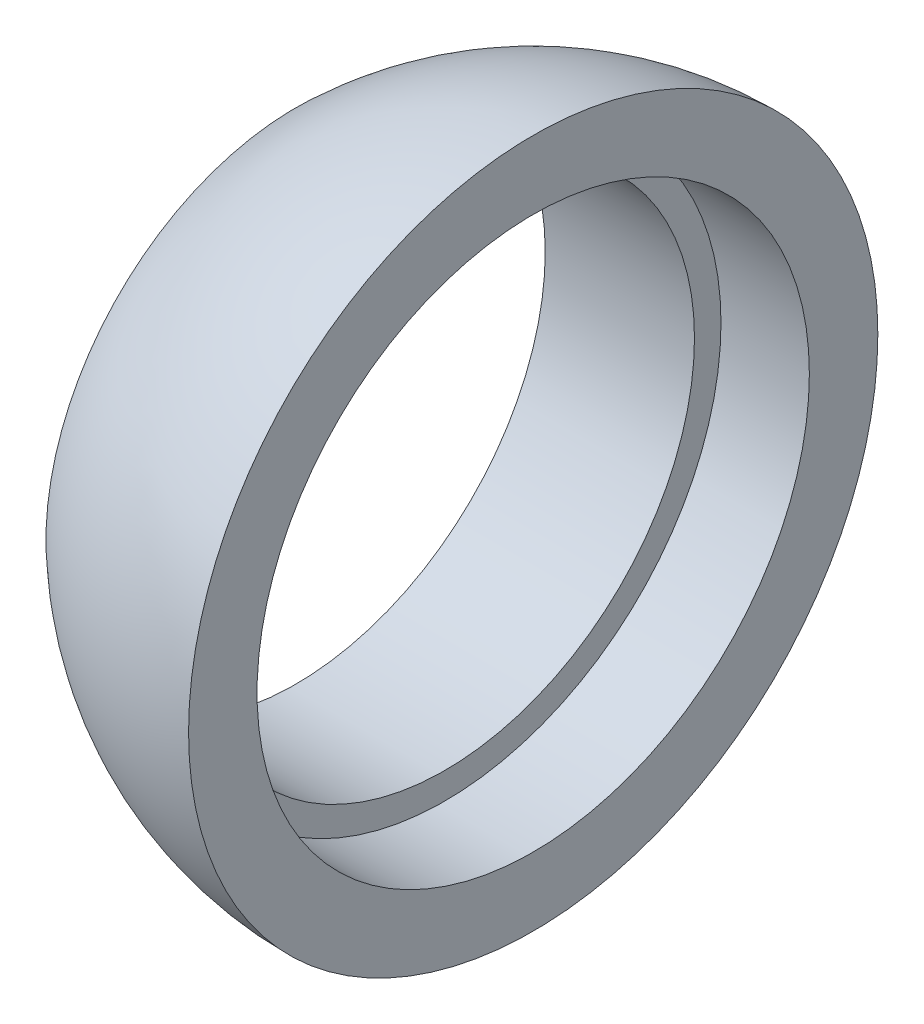
ISO-10303-21;
HEADER;
FILE_DESCRIPTION(('STEP AP214'),'2;1');
FILE_NAME('part.step','',(''),(''),'','','');
FILE_SCHEMA(('AUTOMOTIVE_DESIGN { 1 0 10303 214 1 1 1 1 }'));
ENDSEC;
DATA;
#1=APPLICATION_CONTEXT('core data for automotive mechanical design processes');
#2=APPLICATION_PROTOCOL_DEFINITION('international standard','automotive_design',2000,#1);
#3=PRODUCT_CONTEXT('',#1,'mechanical');
#4=PRODUCT('Part','Part','',(#3));
#5=PRODUCT_RELATED_PRODUCT_CATEGORY('part','',(#4));
#6=PRODUCT_DEFINITION_FORMATION('','',#4);
#7=PRODUCT_DEFINITION_CONTEXT('part definition',#1,'design');
#8=PRODUCT_DEFINITION('design','',#6,#7);
#9=PRODUCT_DEFINITION_SHAPE('','',#8);
#10=(LENGTH_UNIT() NAMED_UNIT(*) SI_UNIT(.MILLI.,.METRE.));
#11=(NAMED_UNIT(*) PLANE_ANGLE_UNIT() SI_UNIT($,.RADIAN.));
#12=(NAMED_UNIT(*) SI_UNIT($,.STERADIAN.) SOLID_ANGLE_UNIT());
#13=UNCERTAINTY_MEASURE_WITH_UNIT(LENGTH_MEASURE(1.E-05),#10,'distance_accuracy_value','');
#14=(GEOMETRIC_REPRESENTATION_CONTEXT(3) GLOBAL_UNCERTAINTY_ASSIGNED_CONTEXT((#13)) GLOBAL_UNIT_ASSIGNED_CONTEXT((#10,
#11,#12)) REPRESENTATION_CONTEXT('',''));
#15=CARTESIAN_POINT('',(0.,0.,0.));
#16=DIRECTION('',(0.,0.,1.));
#17=DIRECTION('',(1.,0.,0.));
#18=AXIS2_PLACEMENT_3D('',#15,#16,#17);
#19=CARTESIAN_POINT('',(-5.5,0.,0.));
#20=DIRECTION('',(1.,0.,0.));
#21=DIRECTION('',(0.,0.,-1.));
#22=AXIS2_PLACEMENT_3D('',#19,#20,#21);
#23=CYLINDRICAL_SURFACE('',#22,5.65);
#24=CARTESIAN_POINT('',(-5.37749941887491,0.,0.));
#25=DIRECTION('',(1.,0.,0.));
#26=DIRECTION('',(0.,0.,-1.));
#27=AXIS2_PLACEMENT_3D('',#24,#25,#26);
#28=CIRCLE('',#27,5.65);
#29=CARTESIAN_POINT('',(-5.37749941887491,0.,-5.65));
#30=VERTEX_POINT('',#29);
#31=EDGE_CURVE('E49',#30,#30,#28,.F.);
#32=ORIENTED_EDGE('',*,*,#31,.T.);
#33=EDGE_LOOP('',(#32));
#34=FACE_BOUND('',#33,.T.);
#35=CARTESIAN_POINT('',(-2.,0.,0.));
#36=DIRECTION('',(1.,0.,0.));
#37=DIRECTION('',(0.,0.,-1.));
#38=AXIS2_PLACEMENT_3D('',#35,#36,#37);
#39=CIRCLE('',#38,5.65);
#40=CARTESIAN_POINT('',(-2.,0.,-5.65));
#41=VERTEX_POINT('',#40);
#42=EDGE_CURVE('E45',#41,#41,#39,.F.);
#43=ORIENTED_EDGE('',*,*,#42,.F.);
#44=EDGE_LOOP('',(#43));
#45=FACE_BOUND('',#44,.T.);
#46=ADVANCED_FACE('F41',(#34,#45),#23,.F.);
#47=CARTESIAN_POINT('',(0.,0.,0.));
#48=DIRECTION('',(0.,1.,0.));
#49=DIRECTION('',(0.,0.,1.));
#50=AXIS2_PLACEMENT_3D('',#47,#48,#49);
#51=SPHERICAL_SURFACE('',#50,7.8);
#52=CARTESIAN_POINT('',(0.,0.,0.));
#53=DIRECTION('',(1.,0.,0.));
#54=DIRECTION('',(0.,0.,-1.));
#55=AXIS2_PLACEMENT_3D('',#52,#53,#54);
#56=SPHERICAL_SURFACE('',#55,7.8);
#57=ORIENTED_EDGE('',*,*,#31,.F.);
#58=EDGE_LOOP('',(#57));
#59=FACE_BOUND('',#58,.T.);
#60=CARTESIAN_POINT('',(0.,0.,0.));
#61=DIRECTION('',(-1.,0.,0.));
#62=DIRECTION('',(0.,0.,1.));
#63=AXIS2_PLACEMENT_3D('',#60,#61,#62);
#64=CIRCLE('',#63,7.8);
#65=CARTESIAN_POINT('',(0.,0.,7.8));
#66=VERTEX_POINT('',#65);
#67=EDGE_CURVE('E10',#66,#66,#64,.T.);
#68=ORIENTED_EDGE('',*,*,#67,.T.);
#69=EDGE_LOOP('',(#68));
#70=FACE_BOUND('',#69,.T.);
#71=ADVANCED_FACE('F43',(#59,#70),#56,.T.);
#72=CARTESIAN_POINT('',(0.,0.,0.));
#73=DIRECTION('',(-1.,0.,0.));
#74=DIRECTION('',(0.,0.,1.));
#75=AXIS2_PLACEMENT_3D('',#72,#73,#74);
#76=PLANE('',#75);
#77=CARTESIAN_POINT('',(0.,0.,0.));
#78=DIRECTION('',(1.,0.,0.));
#79=DIRECTION('',(0.,0.,-1.));
#80=AXIS2_PLACEMENT_3D('',#77,#78,#79);
#81=CIRCLE('',#80,6.25);
#82=CARTESIAN_POINT('',(0.,0.,-6.25));
#83=VERTEX_POINT('',#82);
#84=EDGE_CURVE('E55',#83,#83,#81,.T.);
#85=ORIENTED_EDGE('',*,*,#84,.F.);
#86=EDGE_LOOP('',(#85));
#87=FACE_BOUND('',#86,.T.);
#88=ORIENTED_EDGE('',*,*,#67,.F.);
#89=EDGE_LOOP('',(#88));
#90=FACE_BOUND('',#89,.T.);
#91=ADVANCED_FACE('F74',(#87,#90),#76,.F.);
#92=CARTESIAN_POINT('',(-2.,0.,0.));
#93=DIRECTION('',(1.,0.,0.));
#94=DIRECTION('',(0.,0.,-1.));
#95=AXIS2_PLACEMENT_3D('',#92,#93,#94);
#96=PLANE('',#95);
#97=CARTESIAN_POINT('',(-2.,0.,0.));
#98=DIRECTION('',(1.,0.,0.));
#99=DIRECTION('',(0.,0.,-1.));
#100=AXIS2_PLACEMENT_3D('',#97,#98,#99);
#101=CIRCLE('',#100,6.25);
#102=CARTESIAN_POINT('',(-2.,0.,-6.25));
#103=VERTEX_POINT('',#102);
#104=EDGE_CURVE('E58',#103,#103,#101,.T.);
#105=ORIENTED_EDGE('',*,*,#104,.T.);
#106=EDGE_LOOP('',(#105));
#107=FACE_BOUND('',#106,.T.);
#108=ORIENTED_EDGE('',*,*,#42,.T.);
#109=EDGE_LOOP('',(#108));
#110=FACE_BOUND('',#109,.T.);
#111=ADVANCED_FACE('F65',(#107,#110),#96,.T.);
#112=CARTESIAN_POINT('',(-2.,0.,0.));
#113=DIRECTION('',(1.,0.,0.));
#114=DIRECTION('',(0.,0.,-1.));
#115=AXIS2_PLACEMENT_3D('',#112,#113,#114);
#116=CYLINDRICAL_SURFACE('',#115,6.25);
#117=ORIENTED_EDGE('',*,*,#104,.F.);
#118=EDGE_LOOP('',(#117));
#119=FACE_BOUND('',#118,.T.);
#120=ORIENTED_EDGE('',*,*,#84,.T.);
#121=EDGE_LOOP('',(#120));
#122=FACE_BOUND('',#121,.T.);
#123=ADVANCED_FACE('F77',(#119,#122),#116,.F.);
#124=CLOSED_SHELL('',(#46,#71,#91,#111,#123));
#125=MANIFOLD_SOLID_BREP('B2',#124);
#126=ADVANCED_BREP_SHAPE_REPRESENTATION('',(#18,#125),#14);
#127=SHAPE_DEFINITION_REPRESENTATION(#9,#126);
ENDSEC;
END-ISO-10303-21;
